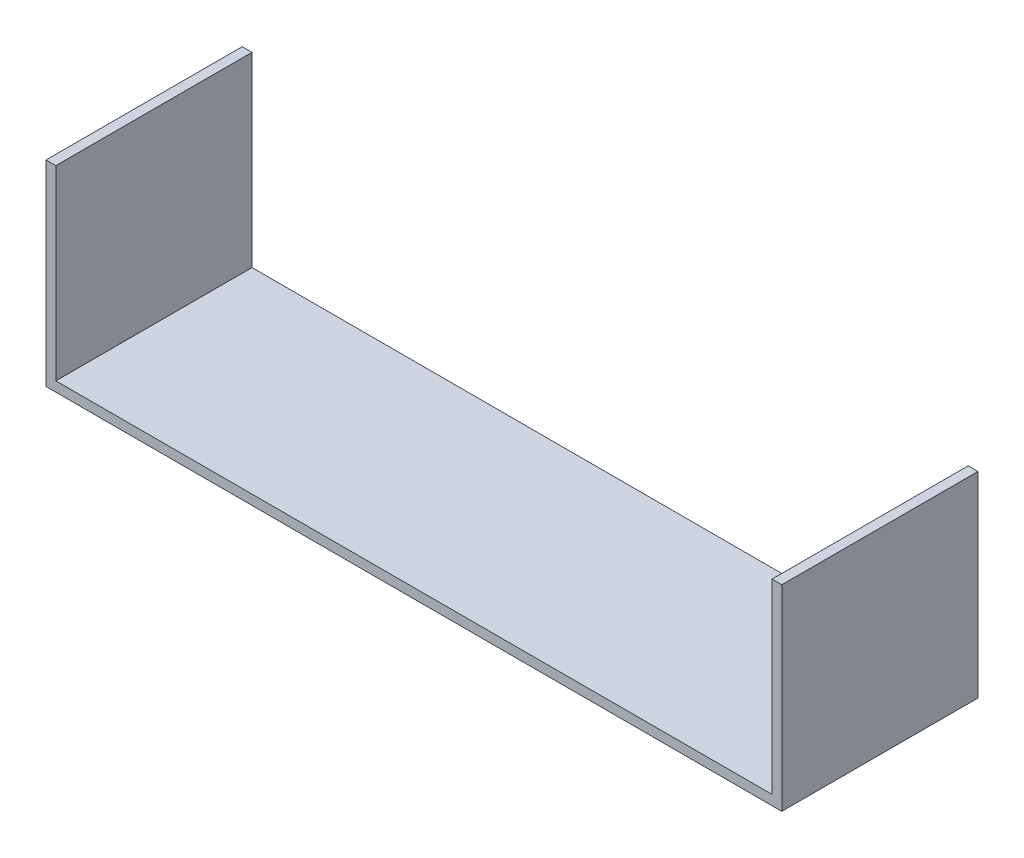
ISO-10303-21;
HEADER;
FILE_DESCRIPTION(('STEP AP214'),'2;1');
FILE_NAME('part.step','',(''),(''),'','','');
FILE_SCHEMA(('AUTOMOTIVE_DESIGN { 1 0 10303 214 1 1 1 1 }'));
ENDSEC;
DATA;
#1=APPLICATION_CONTEXT('core data for automotive mechanical design processes');
#2=APPLICATION_PROTOCOL_DEFINITION('international standard','automotive_design',2000,#1);
#3=PRODUCT_CONTEXT('',#1,'mechanical');
#4=PRODUCT('Part','Part','',(#3));
#5=PRODUCT_RELATED_PRODUCT_CATEGORY('part','',(#4));
#6=PRODUCT_DEFINITION_FORMATION('','',#4);
#7=PRODUCT_DEFINITION_CONTEXT('part definition',#1,'design');
#8=PRODUCT_DEFINITION('design','',#6,#7);
#9=PRODUCT_DEFINITION_SHAPE('','',#8);
#10=(LENGTH_UNIT() NAMED_UNIT(*) SI_UNIT(.MILLI.,.METRE.));
#11=(NAMED_UNIT(*) PLANE_ANGLE_UNIT() SI_UNIT($,.RADIAN.));
#12=(NAMED_UNIT(*) SI_UNIT($,.STERADIAN.) SOLID_ANGLE_UNIT());
#13=UNCERTAINTY_MEASURE_WITH_UNIT(LENGTH_MEASURE(1.E-05),#10,'distance_accuracy_value','');
#14=(GEOMETRIC_REPRESENTATION_CONTEXT(3) GLOBAL_UNCERTAINTY_ASSIGNED_CONTEXT((#13)) GLOBAL_UNIT_ASSIGNED_CONTEXT((#10,
#11,#12)) REPRESENTATION_CONTEXT('',''));
#15=CARTESIAN_POINT('',(0.,0.,0.));
#16=DIRECTION('',(0.,0.,1.));
#17=DIRECTION('',(1.,0.,0.));
#18=AXIS2_PLACEMENT_3D('',#15,#16,#17);
#19=CARTESIAN_POINT('',(-75.,40.,40.));
#20=DIRECTION('',(0.,-1.,0.));
#21=DIRECTION('',(0.,0.,-1.));
#22=AXIS2_PLACEMENT_3D('',#19,#20,#21);
#23=PLANE('',#22);
#24=DIRECTION('',(-1.,0.,0.));
#25=VECTOR('',#24,1.);
#26=CARTESIAN_POINT('',(-75.,40.,0.));
#27=LINE('',#26,#25);
#28=CARTESIAN_POINT('',(-73.,40.,0.));
#29=VERTEX_POINT('',#28);
#30=CARTESIAN_POINT('',(-75.,40.,0.));
#31=VERTEX_POINT('',#30);
#32=EDGE_CURVE('E133',#29,#31,#27,.T.);
#33=ORIENTED_EDGE('',*,*,#32,.T.);
#34=DIRECTION('',(0.,0.,-1.));
#35=VECTOR('',#34,1.);
#36=CARTESIAN_POINT('',(-75.,40.,40.));
#37=LINE('',#36,#35);
#38=CARTESIAN_POINT('',(-75.,40.,40.));
#39=VERTEX_POINT('',#38);
#40=EDGE_CURVE('E11',#39,#31,#37,.T.);
#41=ORIENTED_EDGE('',*,*,#40,.F.);
#42=DIRECTION('',(-1.,0.,0.));
#43=VECTOR('',#42,1.);
#44=CARTESIAN_POINT('',(-75.,40.,40.));
#45=LINE('',#44,#43);
#46=CARTESIAN_POINT('',(-73.,40.,40.));
#47=VERTEX_POINT('',#46);
#48=EDGE_CURVE('E147',#47,#39,#45,.T.);
#49=ORIENTED_EDGE('',*,*,#48,.F.);
#50=DIRECTION('',(0.,0.,-1.));
#51=VECTOR('',#50,1.);
#52=CARTESIAN_POINT('',(-73.,40.,40.));
#53=LINE('',#52,#51);
#54=EDGE_CURVE('E129',#47,#29,#53,.T.);
#55=ORIENTED_EDGE('',*,*,#54,.T.);
#56=EDGE_LOOP('',(#33,#41,#49,#55));
#57=FACE_BOUND('',#56,.T.);
#58=ADVANCED_FACE('F37',(#57),#23,.F.);
#59=CARTESIAN_POINT('',(-75.,40.,40.));
#60=DIRECTION('',(1.,0.,0.));
#61=DIRECTION('',(0.,1.,0.));
#62=AXIS2_PLACEMENT_3D('',#59,#60,#61);
#63=PLANE('',#62);
#64=DIRECTION('',(0.,-1.,0.));
#65=VECTOR('',#64,1.);
#66=CARTESIAN_POINT('',(-75.,40.,0.));
#67=LINE('',#66,#65);
#68=CARTESIAN_POINT('',(-75.,0.,0.));
#69=VERTEX_POINT('',#68);
#70=EDGE_CURVE('E136',#31,#69,#67,.T.);
#71=ORIENTED_EDGE('',*,*,#70,.T.);
#72=DIRECTION('',(0.,0.,-1.));
#73=VECTOR('',#72,1.);
#74=CARTESIAN_POINT('',(-75.,0.,40.));
#75=LINE('',#74,#73);
#76=CARTESIAN_POINT('',(-75.,0.,40.));
#77=VERTEX_POINT('',#76);
#78=EDGE_CURVE('E45',#77,#69,#75,.T.);
#79=ORIENTED_EDGE('',*,*,#78,.F.);
#80=DIRECTION('',(0.,-1.,0.));
#81=VECTOR('',#80,1.);
#82=CARTESIAN_POINT('',(-75.,40.,40.));
#83=LINE('',#82,#81);
#84=EDGE_CURVE('E96',#39,#77,#83,.T.);
#85=ORIENTED_EDGE('',*,*,#84,.F.);
#86=ORIENTED_EDGE('',*,*,#40,.T.);
#87=EDGE_LOOP('',(#71,#79,#85,#86));
#88=FACE_BOUND('',#87,.T.);
#89=ADVANCED_FACE('F182',(#88),#63,.F.);
#90=CARTESIAN_POINT('',(-75.,0.,40.));
#91=DIRECTION('',(0.,1.,0.));
#92=DIRECTION('',(0.,0.,1.));
#93=AXIS2_PLACEMENT_3D('',#90,#91,#92);
#94=PLANE('',#93);
#95=DIRECTION('',(1.,0.,0.));
#96=VECTOR('',#95,1.);
#97=CARTESIAN_POINT('',(-75.,0.,0.));
#98=LINE('',#97,#96);
#99=CARTESIAN_POINT('',(75.,0.,0.));
#100=VERTEX_POINT('',#99);
#101=EDGE_CURVE('E138',#69,#100,#98,.T.);
#102=ORIENTED_EDGE('',*,*,#101,.T.);
#103=DIRECTION('',(0.,0.,-1.));
#104=VECTOR('',#103,1.);
#105=CARTESIAN_POINT('',(75.,0.,40.));
#106=LINE('',#105,#104);
#107=CARTESIAN_POINT('',(75.,0.,40.));
#108=VERTEX_POINT('',#107);
#109=EDGE_CURVE('E154',#108,#100,#106,.T.);
#110=ORIENTED_EDGE('',*,*,#109,.F.);
#111=DIRECTION('',(1.,0.,0.));
#112=VECTOR('',#111,1.);
#113=CARTESIAN_POINT('',(-75.,0.,40.));
#114=LINE('',#113,#112);
#115=EDGE_CURVE('E162',#77,#108,#114,.T.);
#116=ORIENTED_EDGE('',*,*,#115,.F.);
#117=ORIENTED_EDGE('',*,*,#78,.T.);
#118=EDGE_LOOP('',(#102,#110,#116,#117));
#119=FACE_BOUND('',#118,.T.);
#120=ADVANCED_FACE('F160',(#119),#94,.F.);
#121=CARTESIAN_POINT('',(75.,0.,40.));
#122=DIRECTION('',(-1.,0.,0.));
#123=DIRECTION('',(0.,-1.,0.));
#124=AXIS2_PLACEMENT_3D('',#121,#122,#123);
#125=PLANE('',#124);
#126=DIRECTION('',(0.,1.,0.));
#127=VECTOR('',#126,1.);
#128=CARTESIAN_POINT('',(75.,0.,0.));
#129=LINE('',#128,#127);
#130=CARTESIAN_POINT('',(75.,40.,0.));
#131=VERTEX_POINT('',#130);
#132=EDGE_CURVE('E140',#100,#131,#129,.T.);
#133=ORIENTED_EDGE('',*,*,#132,.T.);
#134=DIRECTION('',(0.,0.,-1.));
#135=VECTOR('',#134,1.);
#136=CARTESIAN_POINT('',(75.,40.,40.));
#137=LINE('',#136,#135);
#138=CARTESIAN_POINT('',(75.,40.,40.));
#139=VERTEX_POINT('',#138);
#140=EDGE_CURVE('E151',#139,#131,#137,.T.);
#141=ORIENTED_EDGE('',*,*,#140,.F.);
#142=DIRECTION('',(0.,1.,0.));
#143=VECTOR('',#142,1.);
#144=CARTESIAN_POINT('',(75.,0.,40.));
#145=LINE('',#144,#143);
#146=EDGE_CURVE('E174',#108,#139,#145,.T.);
#147=ORIENTED_EDGE('',*,*,#146,.F.);
#148=ORIENTED_EDGE('',*,*,#109,.T.);
#149=EDGE_LOOP('',(#133,#141,#147,#148));
#150=FACE_BOUND('',#149,.T.);
#151=ADVANCED_FACE('F170',(#150),#125,.F.);
#152=CARTESIAN_POINT('',(73.,40.,40.));
#153=DIRECTION('',(0.,-1.,0.));
#154=DIRECTION('',(0.,0.,-1.));
#155=AXIS2_PLACEMENT_3D('',#152,#153,#154);
#156=PLANE('',#155);
#157=DIRECTION('',(-1.,0.,0.));
#158=VECTOR('',#157,1.);
#159=CARTESIAN_POINT('',(73.,40.,0.));
#160=LINE('',#159,#158);
#161=CARTESIAN_POINT('',(73.,40.,0.));
#162=VERTEX_POINT('',#161);
#163=EDGE_CURVE('E142',#131,#162,#160,.T.);
#164=ORIENTED_EDGE('',*,*,#163,.T.);
#165=DIRECTION('',(0.,0.,-1.));
#166=VECTOR('',#165,1.);
#167=CARTESIAN_POINT('',(73.,40.,40.));
#168=LINE('',#167,#166);
#169=CARTESIAN_POINT('',(73.,40.,40.));
#170=VERTEX_POINT('',#169);
#171=EDGE_CURVE('E124',#170,#162,#168,.T.);
#172=ORIENTED_EDGE('',*,*,#171,.F.);
#173=DIRECTION('',(-1.,0.,0.));
#174=VECTOR('',#173,1.);
#175=CARTESIAN_POINT('',(73.,40.,40.));
#176=LINE('',#175,#174);
#177=EDGE_CURVE('E115',#139,#170,#176,.T.);
#178=ORIENTED_EDGE('',*,*,#177,.F.);
#179=ORIENTED_EDGE('',*,*,#140,.T.);
#180=EDGE_LOOP('',(#164,#172,#178,#179));
#181=FACE_BOUND('',#180,.T.);
#182=ADVANCED_FACE('F173',(#181),#156,.F.);
#183=CARTESIAN_POINT('',(73.,2.,40.));
#184=DIRECTION('',(1.,0.,0.));
#185=DIRECTION('',(0.,0.,-1.));
#186=AXIS2_PLACEMENT_3D('',#183,#184,#185);
#187=PLANE('',#186);
#188=DIRECTION('',(0.,-1.,0.));
#189=VECTOR('',#188,1.);
#190=CARTESIAN_POINT('',(73.,2.,0.));
#191=LINE('',#190,#189);
#192=CARTESIAN_POINT('',(73.,2.,0.));
#193=VERTEX_POINT('',#192);
#194=EDGE_CURVE('E123',#162,#193,#191,.T.);
#195=ORIENTED_EDGE('',*,*,#194,.T.);
#196=DIRECTION('',(0.,0.,-1.));
#197=VECTOR('',#196,1.);
#198=CARTESIAN_POINT('',(73.,2.,40.));
#199=LINE('',#198,#197);
#200=CARTESIAN_POINT('',(73.,2.,40.));
#201=VERTEX_POINT('',#200);
#202=EDGE_CURVE('E120',#201,#193,#199,.T.);
#203=ORIENTED_EDGE('',*,*,#202,.F.);
#204=DIRECTION('',(0.,-1.,0.));
#205=VECTOR('',#204,1.);
#206=CARTESIAN_POINT('',(73.,2.,40.));
#207=LINE('',#206,#205);
#208=EDGE_CURVE('E109',#170,#201,#207,.T.);
#209=ORIENTED_EDGE('',*,*,#208,.F.);
#210=ORIENTED_EDGE('',*,*,#171,.T.);
#211=EDGE_LOOP('',(#195,#203,#209,#210));
#212=FACE_BOUND('',#211,.T.);
#213=ADVANCED_FACE('F121',(#212),#187,.F.);
#214=CARTESIAN_POINT('',(-73.,2.,40.));
#215=DIRECTION('',(0.,-1.,0.));
#216=DIRECTION('',(0.,0.,-1.));
#217=AXIS2_PLACEMENT_3D('',#214,#215,#216);
#218=PLANE('',#217);
#219=DIRECTION('',(-1.,0.,0.));
#220=VECTOR('',#219,1.);
#221=CARTESIAN_POINT('',(-73.,2.,0.));
#222=LINE('',#221,#220);
#223=CARTESIAN_POINT('',(-73.,2.,0.));
#224=VERTEX_POINT('',#223);
#225=EDGE_CURVE('E82',#193,#224,#222,.T.);
#226=ORIENTED_EDGE('',*,*,#225,.T.);
#227=DIRECTION('',(0.,0.,-1.));
#228=VECTOR('',#227,1.);
#229=CARTESIAN_POINT('',(-73.,2.,40.));
#230=LINE('',#229,#228);
#231=CARTESIAN_POINT('',(-73.,2.,40.));
#232=VERTEX_POINT('',#231);
#233=EDGE_CURVE('E125',#232,#224,#230,.T.);
#234=ORIENTED_EDGE('',*,*,#233,.F.);
#235=DIRECTION('',(-1.,0.,0.));
#236=VECTOR('',#235,1.);
#237=CARTESIAN_POINT('',(-73.,2.,40.));
#238=LINE('',#237,#236);
#239=EDGE_CURVE('E113',#201,#232,#238,.T.);
#240=ORIENTED_EDGE('',*,*,#239,.F.);
#241=ORIENTED_EDGE('',*,*,#202,.T.);
#242=EDGE_LOOP('',(#226,#234,#240,#241));
#243=FACE_BOUND('',#242,.T.);
#244=ADVANCED_FACE('F127',(#243),#218,.F.);
#245=CARTESIAN_POINT('',(-73.,40.,40.));
#246=DIRECTION('',(-1.,0.,0.));
#247=DIRECTION('',(0.,0.,1.));
#248=AXIS2_PLACEMENT_3D('',#245,#246,#247);
#249=PLANE('',#248);
#250=DIRECTION('',(0.,1.,0.));
#251=VECTOR('',#250,1.);
#252=CARTESIAN_POINT('',(-73.,40.,0.));
#253=LINE('',#252,#251);
#254=EDGE_CURVE('E88',#224,#29,#253,.T.);
#255=ORIENTED_EDGE('',*,*,#254,.T.);
#256=ORIENTED_EDGE('',*,*,#54,.F.);
#257=DIRECTION('',(0.,1.,0.));
#258=VECTOR('',#257,1.);
#259=CARTESIAN_POINT('',(-73.,40.,40.));
#260=LINE('',#259,#258);
#261=EDGE_CURVE('E53',#232,#47,#260,.T.);
#262=ORIENTED_EDGE('',*,*,#261,.F.);
#263=ORIENTED_EDGE('',*,*,#233,.T.);
#264=EDGE_LOOP('',(#255,#256,#262,#263));
#265=FACE_BOUND('',#264,.T.);
#266=ADVANCED_FACE('F198',(#265),#249,.F.);
#267=CARTESIAN_POINT('',(0.,0.,40.));
#268=DIRECTION('',(0.,0.,-1.));
#269=DIRECTION('',(-1.,0.,0.));
#270=AXIS2_PLACEMENT_3D('',#267,#268,#269);
#271=PLANE('',#270);
#272=ORIENTED_EDGE('',*,*,#48,.T.);
#273=ORIENTED_EDGE('',*,*,#84,.T.);
#274=ORIENTED_EDGE('',*,*,#115,.T.);
#275=ORIENTED_EDGE('',*,*,#146,.T.);
#276=ORIENTED_EDGE('',*,*,#177,.T.);
#277=ORIENTED_EDGE('',*,*,#208,.T.);
#278=ORIENTED_EDGE('',*,*,#239,.T.);
#279=ORIENTED_EDGE('',*,*,#261,.T.);
#280=EDGE_LOOP('',(#272,#273,#274,#275,#276,#277,#278,#279));
#281=FACE_BOUND('',#280,.T.);
#282=ADVANCED_FACE('F111',(#281),#271,.F.);
#283=CARTESIAN_POINT('',(0.,0.,0.));
#284=DIRECTION('',(0.,0.,-1.));
#285=DIRECTION('',(-1.,0.,0.));
#286=AXIS2_PLACEMENT_3D('',#283,#284,#285);
#287=PLANE('',#286);
#288=ORIENTED_EDGE('',*,*,#32,.F.);
#289=ORIENTED_EDGE('',*,*,#254,.F.);
#290=ORIENTED_EDGE('',*,*,#225,.F.);
#291=ORIENTED_EDGE('',*,*,#194,.F.);
#292=ORIENTED_EDGE('',*,*,#163,.F.);
#293=ORIENTED_EDGE('',*,*,#132,.F.);
#294=ORIENTED_EDGE('',*,*,#101,.F.);
#295=ORIENTED_EDGE('',*,*,#70,.F.);
#296=EDGE_LOOP('',(#288,#289,#290,#291,#292,#293,#294,#295));
#297=FACE_BOUND('',#296,.T.);
#298=ADVANCED_FACE('F166',(#297),#287,.T.);
#299=CLOSED_SHELL('',(#58,#89,#120,#151,#182,#213,#244,#266,#282,#298));
#300=MANIFOLD_SOLID_BREP('B2',#299);
#301=ADVANCED_BREP_SHAPE_REPRESENTATION('',(#18,#300),#14);
#302=SHAPE_DEFINITION_REPRESENTATION(#9,#301);
ENDSEC;
END-ISO-10303-21;
